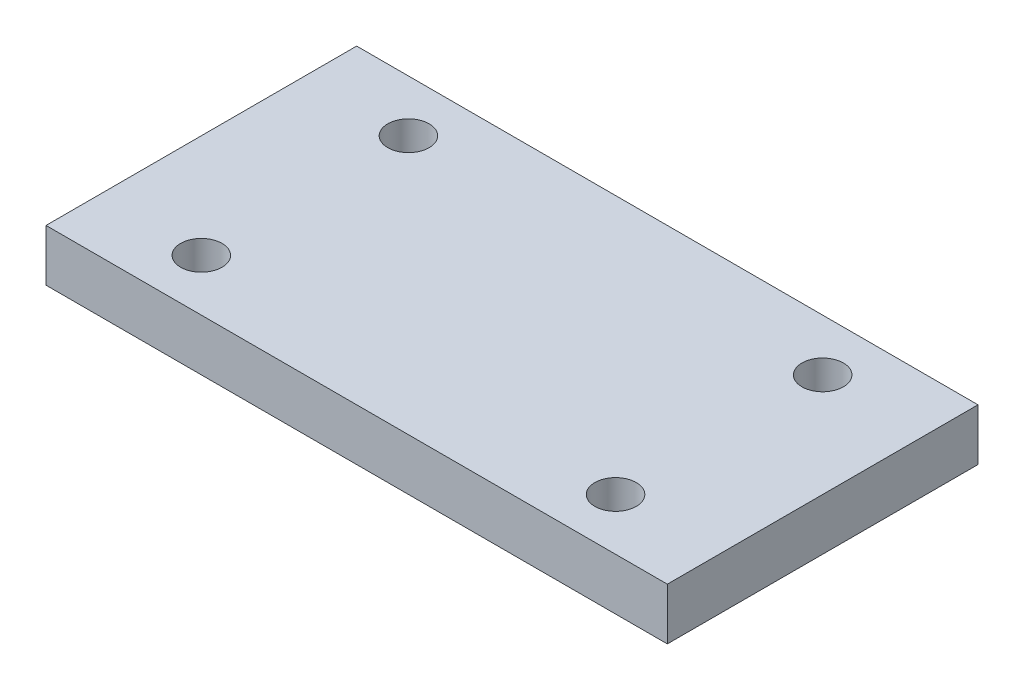
ISO-10303-21;
HEADER;
FILE_DESCRIPTION(('STEP AP214'),'2;1');
FILE_NAME('part.step','',(''),(''),'','','');
FILE_SCHEMA(('AUTOMOTIVE_DESIGN { 1 0 10303 214 1 1 1 1 }'));
ENDSEC;
DATA;
#1=APPLICATION_CONTEXT('core data for automotive mechanical design processes');
#2=APPLICATION_PROTOCOL_DEFINITION('international standard','automotive_design',2000,#1);
#3=PRODUCT_CONTEXT('',#1,'mechanical');
#4=PRODUCT('Part','Part','',(#3));
#5=PRODUCT_RELATED_PRODUCT_CATEGORY('part','',(#4));
#6=PRODUCT_DEFINITION_FORMATION('','',#4);
#7=PRODUCT_DEFINITION_CONTEXT('part definition',#1,'design');
#8=PRODUCT_DEFINITION('design','',#6,#7);
#9=PRODUCT_DEFINITION_SHAPE('','',#8);
#10=(LENGTH_UNIT() NAMED_UNIT(*) SI_UNIT(.MILLI.,.METRE.));
#11=(NAMED_UNIT(*) PLANE_ANGLE_UNIT() SI_UNIT($,.RADIAN.));
#12=(NAMED_UNIT(*) SI_UNIT($,.STERADIAN.) SOLID_ANGLE_UNIT());
#13=UNCERTAINTY_MEASURE_WITH_UNIT(LENGTH_MEASURE(1.E-05),#10,'distance_accuracy_value','');
#14=(GEOMETRIC_REPRESENTATION_CONTEXT(3) GLOBAL_UNCERTAINTY_ASSIGNED_CONTEXT((#13)) GLOBAL_UNIT_ASSIGNED_CONTEXT((#10,
#11,#12)) REPRESENTATION_CONTEXT('',''));
#15=CARTESIAN_POINT('',(0.,0.,0.));
#16=DIRECTION('',(0.,0.,1.));
#17=DIRECTION('',(1.,0.,0.));
#18=AXIS2_PLACEMENT_3D('',#15,#16,#17);
#19=CARTESIAN_POINT('',(30.,5.,0.));
#20=DIRECTION('',(1.,0.,0.));
#21=DIRECTION('',(0.,0.,-1.));
#22=AXIS2_PLACEMENT_3D('',#19,#20,#21);
#23=PLANE('',#22);
#24=DIRECTION('',(0.,0.,1.));
#25=VECTOR('',#24,1.);
#26=CARTESIAN_POINT('',(30.,0.,0.));
#27=LINE('',#26,#25);
#28=CARTESIAN_POINT('',(30.,0.,-15.));
#29=VERTEX_POINT('',#28);
#30=CARTESIAN_POINT('',(30.,0.,15.));
#31=VERTEX_POINT('',#30);
#32=EDGE_CURVE('E116',#29,#31,#27,.T.);
#33=ORIENTED_EDGE('',*,*,#32,.F.);
#34=DIRECTION('',(0.,-1.,0.));
#35=VECTOR('',#34,1.);
#36=CARTESIAN_POINT('',(30.,5.,-15.));
#37=LINE('',#36,#35);
#38=CARTESIAN_POINT('',(30.,5.,-15.));
#39=VERTEX_POINT('',#38);
#40=EDGE_CURVE('E11',#39,#29,#37,.T.);
#41=ORIENTED_EDGE('',*,*,#40,.F.);
#42=DIRECTION('',(0.,0.,1.));
#43=VECTOR('',#42,1.);
#44=CARTESIAN_POINT('',(30.,5.,0.));
#45=LINE('',#44,#43);
#46=CARTESIAN_POINT('',(30.,5.,15.));
#47=VERTEX_POINT('',#46);
#48=EDGE_CURVE('E97',#39,#47,#45,.T.);
#49=ORIENTED_EDGE('',*,*,#48,.T.);
#50=DIRECTION('',(0.,-1.,0.));
#51=VECTOR('',#50,1.);
#52=CARTESIAN_POINT('',(30.,5.,15.));
#53=LINE('',#52,#51);
#54=EDGE_CURVE('E76',#47,#31,#53,.T.);
#55=ORIENTED_EDGE('',*,*,#54,.T.);
#56=EDGE_LOOP('',(#33,#41,#49,#55));
#57=FACE_BOUND('',#56,.T.);
#58=ADVANCED_FACE('F36',(#57),#23,.T.);
#59=CARTESIAN_POINT('',(0.,5.,-15.));
#60=DIRECTION('',(0.,0.,-1.));
#61=DIRECTION('',(-1.,0.,0.));
#62=AXIS2_PLACEMENT_3D('',#59,#60,#61);
#63=PLANE('',#62);
#64=DIRECTION('',(1.,0.,0.));
#65=VECTOR('',#64,1.);
#66=CARTESIAN_POINT('',(0.,0.,-15.));
#67=LINE('',#66,#65);
#68=CARTESIAN_POINT('',(-30.,0.,-15.));
#69=VERTEX_POINT('',#68);
#70=EDGE_CURVE('E88',#69,#29,#67,.T.);
#71=ORIENTED_EDGE('',*,*,#70,.F.);
#72=DIRECTION('',(0.,-1.,0.));
#73=VECTOR('',#72,1.);
#74=CARTESIAN_POINT('',(-30.,5.,-15.));
#75=LINE('',#74,#73);
#76=CARTESIAN_POINT('',(-30.,5.,-15.));
#77=VERTEX_POINT('',#76);
#78=EDGE_CURVE('E45',#77,#69,#75,.T.);
#79=ORIENTED_EDGE('',*,*,#78,.F.);
#80=DIRECTION('',(1.,0.,0.));
#81=VECTOR('',#80,1.);
#82=CARTESIAN_POINT('',(0.,5.,-15.));
#83=LINE('',#82,#81);
#84=EDGE_CURVE('E86',#77,#39,#83,.T.);
#85=ORIENTED_EDGE('',*,*,#84,.T.);
#86=ORIENTED_EDGE('',*,*,#40,.T.);
#87=EDGE_LOOP('',(#71,#79,#85,#86));
#88=FACE_BOUND('',#87,.T.);
#89=ADVANCED_FACE('F84',(#88),#63,.T.);
#90=CARTESIAN_POINT('',(-30.,5.,0.));
#91=DIRECTION('',(1.,0.,0.));
#92=DIRECTION('',(0.,0.,-1.));
#93=AXIS2_PLACEMENT_3D('',#90,#91,#92);
#94=PLANE('',#93);
#95=DIRECTION('',(0.,0.,1.));
#96=VECTOR('',#95,1.);
#97=CARTESIAN_POINT('',(-30.,0.,0.));
#98=LINE('',#97,#96);
#99=CARTESIAN_POINT('',(-30.,0.,15.));
#100=VERTEX_POINT('',#99);
#101=EDGE_CURVE('E119',#69,#100,#98,.T.);
#102=ORIENTED_EDGE('',*,*,#101,.T.);
#103=DIRECTION('',(0.,-1.,0.));
#104=VECTOR('',#103,1.);
#105=CARTESIAN_POINT('',(-30.,5.,15.));
#106=LINE('',#105,#104);
#107=CARTESIAN_POINT('',(-30.,5.,15.));
#108=VERTEX_POINT('',#107);
#109=EDGE_CURVE('E91',#108,#100,#106,.T.);
#110=ORIENTED_EDGE('',*,*,#109,.F.);
#111=DIRECTION('',(0.,0.,1.));
#112=VECTOR('',#111,1.);
#113=CARTESIAN_POINT('',(-30.,5.,0.));
#114=LINE('',#113,#112);
#115=EDGE_CURVE('E93',#77,#108,#114,.T.);
#116=ORIENTED_EDGE('',*,*,#115,.F.);
#117=ORIENTED_EDGE('',*,*,#78,.T.);
#118=EDGE_LOOP('',(#102,#110,#116,#117));
#119=FACE_BOUND('',#118,.T.);
#120=ADVANCED_FACE('F94',(#119),#94,.F.);
#121=CARTESIAN_POINT('',(-20.,5.,-10.));
#122=DIRECTION('',(0.,-1.,0.));
#123=DIRECTION('',(0.,0.,-1.));
#124=AXIS2_PLACEMENT_3D('',#121,#122,#123);
#125=CYLINDRICAL_SURFACE('',#124,2.);
#126=CARTESIAN_POINT('',(-20.,5.,-10.));
#127=DIRECTION('',(0.,1.,0.));
#128=DIRECTION('',(0.,0.,1.));
#129=AXIS2_PLACEMENT_3D('',#126,#127,#128);
#130=CIRCLE('',#129,2.);
#131=CARTESIAN_POINT('',(-20.,5.,-8.00000000000001));
#132=VERTEX_POINT('',#131);
#133=EDGE_CURVE('E99',#132,#132,#130,.T.);
#134=ORIENTED_EDGE('',*,*,#133,.T.);
#135=EDGE_LOOP('',(#134));
#136=FACE_BOUND('',#135,.T.);
#137=CARTESIAN_POINT('',(-20.,0.,-10.));
#138=DIRECTION('',(0.,1.,0.));
#139=DIRECTION('',(0.,0.,1.));
#140=AXIS2_PLACEMENT_3D('',#137,#138,#139);
#141=CIRCLE('',#140,2.);
#142=CARTESIAN_POINT('',(-20.,0.,-8.00000000000001));
#143=VERTEX_POINT('',#142);
#144=EDGE_CURVE('E113',#143,#143,#141,.T.);
#145=ORIENTED_EDGE('',*,*,#144,.F.);
#146=EDGE_LOOP('',(#145));
#147=FACE_BOUND('',#146,.T.);
#148=ADVANCED_FACE('F135',(#136,#147),#125,.F.);
#149=CARTESIAN_POINT('',(20.,5.,-10.));
#150=DIRECTION('',(0.,-1.,0.));
#151=DIRECTION('',(0.,0.,-1.));
#152=AXIS2_PLACEMENT_3D('',#149,#150,#151);
#153=CYLINDRICAL_SURFACE('',#152,2.);
#154=CARTESIAN_POINT('',(20.,5.,-10.));
#155=DIRECTION('',(0.,1.,0.));
#156=DIRECTION('',(0.,0.,1.));
#157=AXIS2_PLACEMENT_3D('',#154,#155,#156);
#158=CIRCLE('',#157,2.);
#159=CARTESIAN_POINT('',(20.,5.,-8.00000000000001));
#160=VERTEX_POINT('',#159);
#161=EDGE_CURVE('E241',#160,#160,#158,.T.);
#162=ORIENTED_EDGE('',*,*,#161,.T.);
#163=EDGE_LOOP('',(#162));
#164=FACE_BOUND('',#163,.T.);
#165=CARTESIAN_POINT('',(20.,0.,-10.));
#166=DIRECTION('',(0.,1.,0.));
#167=DIRECTION('',(0.,0.,1.));
#168=AXIS2_PLACEMENT_3D('',#165,#166,#167);
#169=CIRCLE('',#168,2.);
#170=CARTESIAN_POINT('',(20.,0.,-8.00000000000001));
#171=VERTEX_POINT('',#170);
#172=EDGE_CURVE('E110',#171,#171,#169,.T.);
#173=ORIENTED_EDGE('',*,*,#172,.F.);
#174=EDGE_LOOP('',(#173));
#175=FACE_BOUND('',#174,.T.);
#176=ADVANCED_FACE('F138',(#164,#175),#153,.F.);
#177=CARTESIAN_POINT('',(-20.,5.,9.99999999999999));
#178=DIRECTION('',(0.,-1.,0.));
#179=DIRECTION('',(0.,0.,-1.));
#180=AXIS2_PLACEMENT_3D('',#177,#178,#179);
#181=CYLINDRICAL_SURFACE('',#180,2.);
#182=CARTESIAN_POINT('',(-20.,5.,9.99999999999999));
#183=DIRECTION('',(0.,1.,0.));
#184=DIRECTION('',(0.,0.,1.));
#185=AXIS2_PLACEMENT_3D('',#182,#183,#184);
#186=CIRCLE('',#185,2.);
#187=CARTESIAN_POINT('',(-20.,5.,12.));
#188=VERTEX_POINT('',#187);
#189=EDGE_CURVE('E152',#188,#188,#186,.T.);
#190=ORIENTED_EDGE('',*,*,#189,.T.);
#191=EDGE_LOOP('',(#190));
#192=FACE_BOUND('',#191,.T.);
#193=CARTESIAN_POINT('',(-20.,0.,9.99999999999999));
#194=DIRECTION('',(0.,1.,0.));
#195=DIRECTION('',(0.,0.,1.));
#196=AXIS2_PLACEMENT_3D('',#193,#194,#195);
#197=CIRCLE('',#196,2.);
#198=CARTESIAN_POINT('',(-20.,0.,12.));
#199=VERTEX_POINT('',#198);
#200=EDGE_CURVE('E107',#199,#199,#197,.T.);
#201=ORIENTED_EDGE('',*,*,#200,.F.);
#202=EDGE_LOOP('',(#201));
#203=FACE_BOUND('',#202,.T.);
#204=ADVANCED_FACE('F141',(#192,#203),#181,.F.);
#205=CARTESIAN_POINT('',(20.,5.,9.99999999999999));
#206=DIRECTION('',(0.,-1.,0.));
#207=DIRECTION('',(0.,0.,-1.));
#208=AXIS2_PLACEMENT_3D('',#205,#206,#207);
#209=CYLINDRICAL_SURFACE('',#208,2.);
#210=CARTESIAN_POINT('',(20.,5.,9.99999999999999));
#211=DIRECTION('',(0.,1.,0.));
#212=DIRECTION('',(0.,0.,1.));
#213=AXIS2_PLACEMENT_3D('',#210,#211,#212);
#214=CIRCLE('',#213,2.);
#215=CARTESIAN_POINT('',(20.,5.,12.));
#216=VERTEX_POINT('',#215);
#217=EDGE_CURVE('E122',#216,#216,#214,.T.);
#218=ORIENTED_EDGE('',*,*,#217,.T.);
#219=EDGE_LOOP('',(#218));
#220=FACE_BOUND('',#219,.T.);
#221=CARTESIAN_POINT('',(20.,0.,9.99999999999999));
#222=DIRECTION('',(0.,1.,0.));
#223=DIRECTION('',(0.,0.,1.));
#224=AXIS2_PLACEMENT_3D('',#221,#222,#223);
#225=CIRCLE('',#224,2.);
#226=CARTESIAN_POINT('',(20.,0.,12.));
#227=VERTEX_POINT('',#226);
#228=EDGE_CURVE('E104',#227,#227,#225,.T.);
#229=ORIENTED_EDGE('',*,*,#228,.F.);
#230=EDGE_LOOP('',(#229));
#231=FACE_BOUND('',#230,.T.);
#232=ADVANCED_FACE('F38',(#220,#231),#209,.F.);
#233=CARTESIAN_POINT('',(0.,5.,15.));
#234=DIRECTION('',(0.,0.,-1.));
#235=DIRECTION('',(-1.,0.,0.));
#236=AXIS2_PLACEMENT_3D('',#233,#234,#235);
#237=PLANE('',#236);
#238=DIRECTION('',(1.,0.,0.));
#239=VECTOR('',#238,1.);
#240=CARTESIAN_POINT('',(0.,0.,15.));
#241=LINE('',#240,#239);
#242=EDGE_CURVE('E69',#100,#31,#241,.T.);
#243=ORIENTED_EDGE('',*,*,#242,.T.);
#244=ORIENTED_EDGE('',*,*,#54,.F.);
#245=DIRECTION('',(1.,0.,0.));
#246=VECTOR('',#245,1.);
#247=CARTESIAN_POINT('',(0.,5.,15.));
#248=LINE('',#247,#246);
#249=EDGE_CURVE('E53',#108,#47,#248,.T.);
#250=ORIENTED_EDGE('',*,*,#249,.F.);
#251=ORIENTED_EDGE('',*,*,#109,.T.);
#252=EDGE_LOOP('',(#243,#244,#250,#251));
#253=FACE_BOUND('',#252,.T.);
#254=ADVANCED_FACE('F125',(#253),#237,.F.);
#255=CARTESIAN_POINT('',(0.,5.,0.));
#256=DIRECTION('',(0.,1.,0.));
#257=DIRECTION('',(0.,0.,1.));
#258=AXIS2_PLACEMENT_3D('',#255,#256,#257);
#259=PLANE('',#258);
#260=ORIENTED_EDGE('',*,*,#217,.F.);
#261=EDGE_LOOP('',(#260));
#262=FACE_BOUND('',#261,.T.);
#263=ORIENTED_EDGE('',*,*,#189,.F.);
#264=EDGE_LOOP('',(#263));
#265=FACE_BOUND('',#264,.T.);
#266=ORIENTED_EDGE('',*,*,#161,.F.);
#267=EDGE_LOOP('',(#266));
#268=FACE_BOUND('',#267,.T.);
#269=ORIENTED_EDGE('',*,*,#133,.F.);
#270=EDGE_LOOP('',(#269));
#271=FACE_BOUND('',#270,.T.);
#272=ORIENTED_EDGE('',*,*,#48,.F.);
#273=ORIENTED_EDGE('',*,*,#84,.F.);
#274=ORIENTED_EDGE('',*,*,#115,.T.);
#275=ORIENTED_EDGE('',*,*,#249,.T.);
#276=EDGE_LOOP('',(#272,#273,#274,#275));
#277=FACE_BOUND('',#276,.T.);
#278=ADVANCED_FACE('F96',(#262,#265,#268,#271,#277),#259,.T.);
#279=CARTESIAN_POINT('',(0.,0.,0.));
#280=DIRECTION('',(0.,1.,0.));
#281=DIRECTION('',(0.,0.,1.));
#282=AXIS2_PLACEMENT_3D('',#279,#280,#281);
#283=PLANE('',#282);
#284=ORIENTED_EDGE('',*,*,#228,.T.);
#285=EDGE_LOOP('',(#284));
#286=FACE_BOUND('',#285,.T.);
#287=ORIENTED_EDGE('',*,*,#200,.T.);
#288=EDGE_LOOP('',(#287));
#289=FACE_BOUND('',#288,.T.);
#290=ORIENTED_EDGE('',*,*,#172,.T.);
#291=EDGE_LOOP('',(#290));
#292=FACE_BOUND('',#291,.T.);
#293=ORIENTED_EDGE('',*,*,#144,.T.);
#294=EDGE_LOOP('',(#293));
#295=FACE_BOUND('',#294,.T.);
#296=ORIENTED_EDGE('',*,*,#32,.T.);
#297=ORIENTED_EDGE('',*,*,#242,.F.);
#298=ORIENTED_EDGE('',*,*,#101,.F.);
#299=ORIENTED_EDGE('',*,*,#70,.T.);
#300=EDGE_LOOP('',(#296,#297,#298,#299));
#301=FACE_BOUND('',#300,.T.);
#302=ADVANCED_FACE('F126',(#286,#289,#292,#295,#301),#283,.F.);
#303=CLOSED_SHELL('',(#58,#89,#120,#148,#176,#204,#232,#254,#278,#302));
#304=MANIFOLD_SOLID_BREP('B2',#303);
#305=ADVANCED_BREP_SHAPE_REPRESENTATION('',(#18,#304),#14);
#306=SHAPE_DEFINITION_REPRESENTATION(#9,#305);
ENDSEC;
END-ISO-10303-21;
